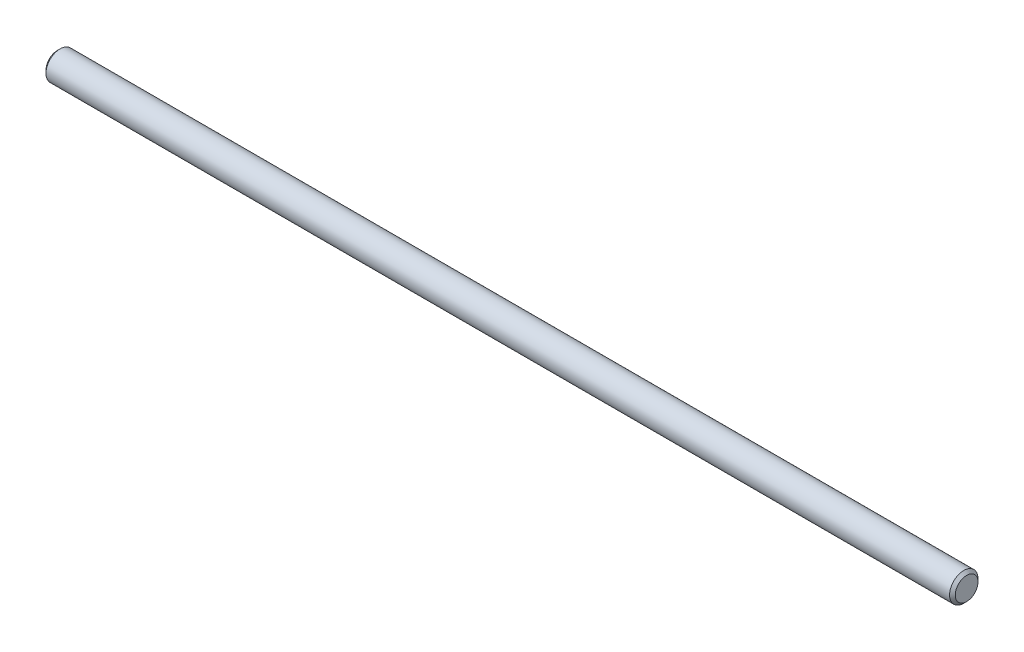
ISO-10303-21;
HEADER;
FILE_DESCRIPTION(('STEP AP214'),'2;1');
FILE_NAME('part.step','',(''),(''),'','','');
FILE_SCHEMA(('AUTOMOTIVE_DESIGN { 1 0 10303 214 1 1 1 1 }'));
ENDSEC;
DATA;
#1=APPLICATION_CONTEXT('core data for automotive mechanical design processes');
#2=APPLICATION_PROTOCOL_DEFINITION('international standard','automotive_design',2000,#1);
#3=PRODUCT_CONTEXT('',#1,'mechanical');
#4=PRODUCT('Part','Part','',(#3));
#5=PRODUCT_RELATED_PRODUCT_CATEGORY('part','',(#4));
#6=PRODUCT_DEFINITION_FORMATION('','',#4);
#7=PRODUCT_DEFINITION_CONTEXT('part definition',#1,'design');
#8=PRODUCT_DEFINITION('design','',#6,#7);
#9=PRODUCT_DEFINITION_SHAPE('','',#8);
#10=(LENGTH_UNIT() NAMED_UNIT(*) SI_UNIT(.MILLI.,.METRE.));
#11=(NAMED_UNIT(*) PLANE_ANGLE_UNIT() SI_UNIT($,.RADIAN.));
#12=(NAMED_UNIT(*) SI_UNIT($,.STERADIAN.) SOLID_ANGLE_UNIT());
#13=UNCERTAINTY_MEASURE_WITH_UNIT(LENGTH_MEASURE(1.E-05),#10,'distance_accuracy_value','');
#14=(GEOMETRIC_REPRESENTATION_CONTEXT(3) GLOBAL_UNCERTAINTY_ASSIGNED_CONTEXT((#13)) GLOBAL_UNIT_ASSIGNED_CONTEXT((#10,
#11,#12)) REPRESENTATION_CONTEXT('',''));
#15=CARTESIAN_POINT('',(0.,0.,0.));
#16=DIRECTION('',(0.,0.,1.));
#17=DIRECTION('',(1.,0.,0.));
#18=AXIS2_PLACEMENT_3D('',#15,#16,#17);
#19=CARTESIAN_POINT('',(-203.2,0.,0.));
#20=DIRECTION('',(1.,0.,0.));
#21=DIRECTION('',(0.,0.,-1.));
#22=AXIS2_PLACEMENT_3D('',#19,#20,#21);
#23=CYLINDRICAL_SURFACE('',#22,6.35);
#24=CARTESIAN_POINT('',(201.93,0.,0.));
#25=DIRECTION('',(1.,0.,0.));
#26=DIRECTION('',(0.,0.,-1.));
#27=AXIS2_PLACEMENT_3D('',#24,#25,#26);
#28=CIRCLE('',#27,6.35);
#29=CARTESIAN_POINT('',(201.93,0.,-6.35));
#30=VERTEX_POINT('',#29);
#31=EDGE_CURVE('E37',#30,#30,#28,.F.);
#32=ORIENTED_EDGE('',*,*,#31,.T.);
#33=EDGE_LOOP('',(#32));
#34=FACE_BOUND('',#33,.T.);
#35=CARTESIAN_POINT('',(-201.93,0.,0.));
#36=DIRECTION('',(1.,0.,0.));
#37=DIRECTION('',(0.,0.,-1.));
#38=AXIS2_PLACEMENT_3D('',#35,#36,#37);
#39=CIRCLE('',#38,6.35);
#40=CARTESIAN_POINT('',(-201.93,0.,-6.35));
#41=VERTEX_POINT('',#40);
#42=EDGE_CURVE('E41',#41,#41,#39,.T.);
#43=ORIENTED_EDGE('',*,*,#42,.T.);
#44=EDGE_LOOP('',(#43));
#45=FACE_BOUND('',#44,.T.);
#46=ADVANCED_FACE('F30',(#34,#45),#23,.T.);
#47=CARTESIAN_POINT('',(-203.2,0.,0.));
#48=DIRECTION('',(1.,0.,0.));
#49=DIRECTION('',(0.,0.,-1.));
#50=AXIS2_PLACEMENT_3D('',#47,#48,#49);
#51=PLANE('',#50);
#52=CARTESIAN_POINT('',(-203.2,0.,0.));
#53=DIRECTION('',(1.,0.,0.));
#54=DIRECTION('',(0.,0.,-1.));
#55=AXIS2_PLACEMENT_3D('',#52,#53,#54);
#56=CIRCLE('',#55,5.07999999999997);
#57=CARTESIAN_POINT('',(-203.2,0.,-5.07999999999997));
#58=VERTEX_POINT('',#57);
#59=EDGE_CURVE('E10',#58,#58,#56,.F.);
#60=ORIENTED_EDGE('',*,*,#59,.T.);
#61=EDGE_LOOP('',(#60));
#62=FACE_BOUND('',#61,.T.);
#63=ADVANCED_FACE('F61',(#62),#51,.F.);
#64=CARTESIAN_POINT('',(203.2,0.,0.));
#65=DIRECTION('',(1.,0.,0.));
#66=DIRECTION('',(0.,0.,-1.));
#67=AXIS2_PLACEMENT_3D('',#64,#65,#66);
#68=PLANE('',#67);
#69=CARTESIAN_POINT('',(203.2,0.,0.));
#70=DIRECTION('',(1.,0.,0.));
#71=DIRECTION('',(0.,0.,-1.));
#72=AXIS2_PLACEMENT_3D('',#69,#70,#71);
#73=CIRCLE('',#72,5.08000000000003);
#74=CARTESIAN_POINT('',(203.2,0.,-5.08000000000003));
#75=VERTEX_POINT('',#74);
#76=EDGE_CURVE('E45',#75,#75,#73,.T.);
#77=ORIENTED_EDGE('',*,*,#76,.T.);
#78=EDGE_LOOP('',(#77));
#79=FACE_BOUND('',#78,.T.);
#80=ADVANCED_FACE('F51',(#79),#68,.T.);
#81=CARTESIAN_POINT('',(203.2,0.,0.));
#82=DIRECTION('',(-1.,0.,0.));
#83=DIRECTION('',(0.,0.,1.));
#84=AXIS2_PLACEMENT_3D('',#81,#82,#83);
#85=CONICAL_SURFACE('',#84,5.08000000000003,0.785398163397461);
#86=ORIENTED_EDGE('',*,*,#31,.F.);
#87=EDGE_LOOP('',(#86));
#88=FACE_BOUND('',#87,.T.);
#89=ORIENTED_EDGE('',*,*,#76,.F.);
#90=EDGE_LOOP('',(#89));
#91=FACE_BOUND('',#90,.T.);
#92=ADVANCED_FACE('F53',(#88,#91),#85,.T.);
#93=CARTESIAN_POINT('',(-201.93,0.,0.));
#94=DIRECTION('',(1.,0.,0.));
#95=DIRECTION('',(0.,0.,-1.));
#96=AXIS2_PLACEMENT_3D('',#93,#94,#95);
#97=CONICAL_SURFACE('',#96,6.35,0.785398163397461);
#98=ORIENTED_EDGE('',*,*,#59,.F.);
#99=EDGE_LOOP('',(#98));
#100=FACE_BOUND('',#99,.T.);
#101=ORIENTED_EDGE('',*,*,#42,.F.);
#102=EDGE_LOOP('',(#101));
#103=FACE_BOUND('',#102,.T.);
#104=ADVANCED_FACE('F32',(#100,#103),#97,.T.);
#105=CLOSED_SHELL('',(#46,#63,#80,#92,#104));
#106=MANIFOLD_SOLID_BREP('B2',#105);
#107=ADVANCED_BREP_SHAPE_REPRESENTATION('',(#18,#106),#14);
#108=SHAPE_DEFINITION_REPRESENTATION(#9,#107);
ENDSEC;
END-ISO-10303-21;
